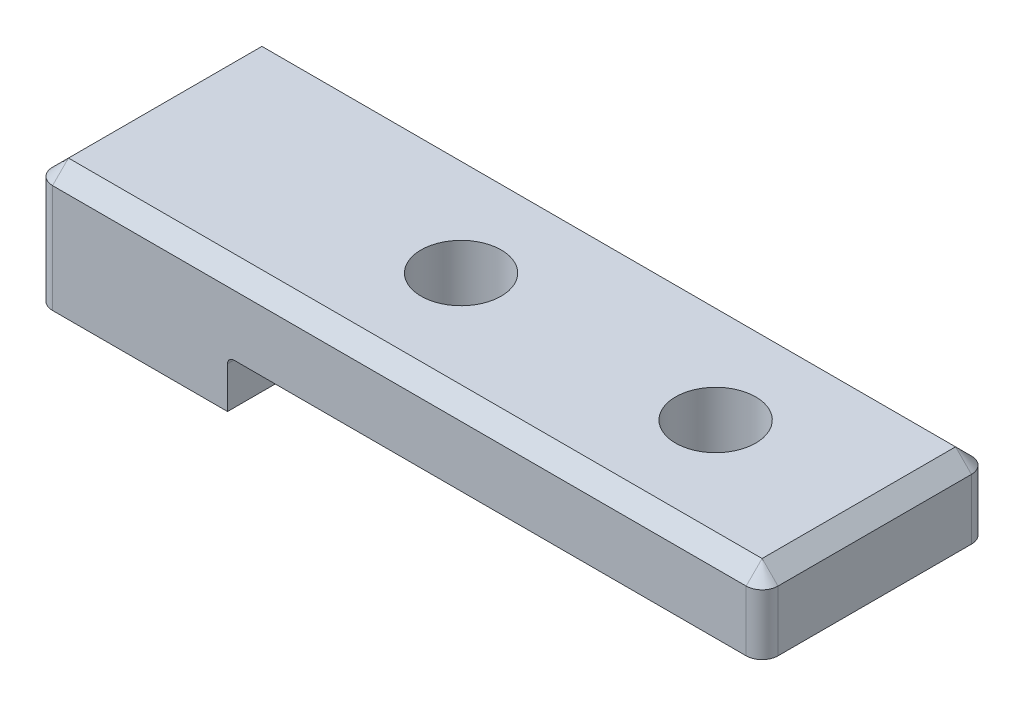
ISO-10303-21;
HEADER;
FILE_DESCRIPTION(('STEP AP214'),'2;1');
FILE_NAME('part.step','',(''),(''),'','','');
FILE_SCHEMA(('AUTOMOTIVE_DESIGN { 1 0 10303 214 1 1 1 1 }'));
ENDSEC;
DATA;
#1=APPLICATION_CONTEXT('core data for automotive mechanical design processes');
#2=APPLICATION_PROTOCOL_DEFINITION('international standard','automotive_design',2000,#1);
#3=PRODUCT_CONTEXT('',#1,'mechanical');
#4=PRODUCT('Part','Part','',(#3));
#5=PRODUCT_RELATED_PRODUCT_CATEGORY('part','',(#4));
#6=PRODUCT_DEFINITION_FORMATION('','',#4);
#7=PRODUCT_DEFINITION_CONTEXT('part definition',#1,'design');
#8=PRODUCT_DEFINITION('design','',#6,#7);
#9=PRODUCT_DEFINITION_SHAPE('','',#8);
#10=(LENGTH_UNIT() NAMED_UNIT(*) SI_UNIT(.MILLI.,.METRE.));
#11=(NAMED_UNIT(*) PLANE_ANGLE_UNIT() SI_UNIT($,.RADIAN.));
#12=(NAMED_UNIT(*) SI_UNIT($,.STERADIAN.) SOLID_ANGLE_UNIT());
#13=UNCERTAINTY_MEASURE_WITH_UNIT(LENGTH_MEASURE(1.E-05),#10,'distance_accuracy_value','');
#14=(GEOMETRIC_REPRESENTATION_CONTEXT(3) GLOBAL_UNCERTAINTY_ASSIGNED_CONTEXT((#13)) GLOBAL_UNIT_ASSIGNED_CONTEXT((#10,
#11,#12)) REPRESENTATION_CONTEXT('',''));
#15=CARTESIAN_POINT('',(0.,0.,0.));
#16=DIRECTION('',(0.,0.,1.));
#17=DIRECTION('',(1.,0.,0.));
#18=AXIS2_PLACEMENT_3D('',#15,#16,#17);
#19=CARTESIAN_POINT('',(0.,0.,0.));
#20=DIRECTION('',(0.,1.,0.));
#21=DIRECTION('',(0.,0.,1.));
#22=AXIS2_PLACEMENT_3D('',#19,#20,#21);
#23=PLANE('',#22);
#24=CARTESIAN_POINT('',(-2.032,0.,0.));
#25=DIRECTION('',(0.,1.,0.));
#26=DIRECTION('',(0.,0.,1.));
#27=AXIS2_PLACEMENT_3D('',#24,#25,#26);
#28=CIRCLE('',#27,1.6002);
#29=CARTESIAN_POINT('',(-2.032,0.,-1.6002));
#30=VERTEX_POINT('',#29);
#31=EDGE_CURVE('E193',#30,#30,#28,.T.);
#32=ORIENTED_EDGE('',*,*,#31,.T.);
#33=EDGE_LOOP('',(#32));
#34=FACE_BOUND('',#33,.T.);
#35=CARTESIAN_POINT('',(8.128,0.,0.));
#36=DIRECTION('',(0.,1.,0.));
#37=DIRECTION('',(0.,0.,1.));
#38=AXIS2_PLACEMENT_3D('',#35,#36,#37);
#39=CIRCLE('',#38,1.6002);
#40=CARTESIAN_POINT('',(8.128,0.,-1.6002));
#41=VERTEX_POINT('',#40);
#42=EDGE_CURVE('E199',#41,#41,#39,.T.);
#43=ORIENTED_EDGE('',*,*,#42,.T.);
#44=EDGE_LOOP('',(#43));
#45=FACE_BOUND('',#44,.T.);
#46=DIRECTION('',(-1.,0.,0.));
#47=VECTOR('',#46,1.);
#48=CARTESIAN_POINT('',(-14.478,0.,-4.4958));
#49=LINE('',#48,#47);
#50=CARTESIAN_POINT('',(13.843,0.,-4.4958));
#51=VERTEX_POINT('',#50);
#52=CARTESIAN_POINT('',(-13.843,0.,-4.4958));
#53=VERTEX_POINT('',#52);
#54=EDGE_CURVE('E214',#51,#53,#49,.T.);
#55=ORIENTED_EDGE('',*,*,#54,.F.);
#56=CARTESIAN_POINT('',(13.843,0.,-3.8608));
#57=DIRECTION('',(0.,1.,0.));
#58=DIRECTION('',(0.,0.,1.));
#59=AXIS2_PLACEMENT_3D('',#56,#57,#58);
#60=CIRCLE('',#59,0.635);
#61=CARTESIAN_POINT('',(14.478,0.,-3.8608));
#62=VERTEX_POINT('',#61);
#63=EDGE_CURVE('E259',#51,#62,#60,.F.);
#64=ORIENTED_EDGE('',*,*,#63,.T.);
#65=DIRECTION('',(0.,0.,-1.));
#66=VECTOR('',#65,1.);
#67=CARTESIAN_POINT('',(14.478,0.,-4.4958));
#68=LINE('',#67,#66);
#69=CARTESIAN_POINT('',(14.478,0.,3.8608));
#70=VERTEX_POINT('',#69);
#71=EDGE_CURVE('E207',#70,#62,#68,.T.);
#72=ORIENTED_EDGE('',*,*,#71,.F.);
#73=CARTESIAN_POINT('',(13.843,0.,3.8608));
#74=DIRECTION('',(0.,1.,0.));
#75=DIRECTION('',(0.,0.,1.));
#76=AXIS2_PLACEMENT_3D('',#73,#74,#75);
#77=CIRCLE('',#76,0.635);
#78=CARTESIAN_POINT('',(13.843,0.,4.4958));
#79=VERTEX_POINT('',#78);
#80=EDGE_CURVE('E256',#70,#79,#77,.F.);
#81=ORIENTED_EDGE('',*,*,#80,.T.);
#82=DIRECTION('',(1.,0.,0.));
#83=VECTOR('',#82,1.);
#84=CARTESIAN_POINT('',(-14.478,0.,4.4958));
#85=LINE('',#84,#83);
#86=CARTESIAN_POINT('',(-6.604,0.,4.4958));
#87=VERTEX_POINT('',#86);
#88=EDGE_CURVE('E221',#87,#79,#85,.T.);
#89=ORIENTED_EDGE('',*,*,#88,.F.);
#90=DIRECTION('',(0.,0.,1.));
#91=VECTOR('',#90,1.);
#92=CARTESIAN_POINT('',(-6.604,0.,0.));
#93=LINE('',#92,#91);
#94=CARTESIAN_POINT('',(-6.604,0.,-2.1082));
#95=VERTEX_POINT('',#94);
#96=EDGE_CURVE('E225',#87,#95,#93,.F.);
#97=ORIENTED_EDGE('',*,*,#96,.T.);
#98=DIRECTION('',(-1.,0.,0.));
#99=VECTOR('',#98,1.);
#100=CARTESIAN_POINT('',(-14.478,0.,-2.1082));
#101=LINE('',#100,#99);
#102=CARTESIAN_POINT('',(-14.478,0.,-2.1082));
#103=VERTEX_POINT('',#102);
#104=EDGE_CURVE('E228',#95,#103,#101,.T.);
#105=ORIENTED_EDGE('',*,*,#104,.T.);
#106=DIRECTION('',(0.,0.,1.));
#107=VECTOR('',#106,1.);
#108=CARTESIAN_POINT('',(-14.478,0.,-4.4958));
#109=LINE('',#108,#107);
#110=CARTESIAN_POINT('',(-14.478,0.,-3.8608));
#111=VERTEX_POINT('',#110);
#112=EDGE_CURVE('E218',#111,#103,#109,.T.);
#113=ORIENTED_EDGE('',*,*,#112,.F.);
#114=CARTESIAN_POINT('',(-13.843,0.,-3.8608));
#115=DIRECTION('',(0.,1.,0.));
#116=DIRECTION('',(0.,0.,1.));
#117=AXIS2_PLACEMENT_3D('',#114,#115,#116);
#118=CIRCLE('',#117,0.635);
#119=EDGE_CURVE('E253',#111,#53,#118,.F.);
#120=ORIENTED_EDGE('',*,*,#119,.T.);
#121=EDGE_LOOP('',(#55,#64,#72,#81,#89,#97,#105,#113,#120));
#122=FACE_BOUND('',#121,.T.);
#123=ADVANCED_FACE('F47',(#34,#45,#122),#23,.F.);
#124=CARTESIAN_POINT('',(0.,3.048,0.));
#125=DIRECTION('',(0.,1.,0.));
#126=DIRECTION('',(0.,0.,1.));
#127=AXIS2_PLACEMENT_3D('',#124,#125,#126);
#128=PLANE('',#127);
#129=DIRECTION('',(1.,0.,0.));
#130=VECTOR('',#129,1.);
#131=CARTESIAN_POINT('',(13.843,3.048,3.8608));
#132=LINE('',#131,#130);
#133=CARTESIAN_POINT('',(-13.843,3.048,3.8608));
#134=VERTEX_POINT('',#133);
#135=CARTESIAN_POINT('',(13.843,3.048,3.8608));
#136=VERTEX_POINT('',#135);
#137=EDGE_CURVE('E287',#134,#136,#132,.T.);
#138=ORIENTED_EDGE('',*,*,#137,.T.);
#139=DIRECTION('',(0.,0.,-1.));
#140=VECTOR('',#139,1.);
#141=CARTESIAN_POINT('',(13.843,3.048,-3.8608));
#142=LINE('',#141,#140);
#143=CARTESIAN_POINT('',(13.843,3.048,-3.8608));
#144=VERTEX_POINT('',#143);
#145=EDGE_CURVE('E293',#136,#144,#142,.T.);
#146=ORIENTED_EDGE('',*,*,#145,.T.);
#147=DIRECTION('',(-1.,0.,0.));
#148=VECTOR('',#147,1.);
#149=CARTESIAN_POINT('',(-13.843,3.048,-3.8608));
#150=LINE('',#149,#148);
#151=CARTESIAN_POINT('',(-13.843,3.048,-3.8608));
#152=VERTEX_POINT('',#151);
#153=EDGE_CURVE('E290',#144,#152,#150,.T.);
#154=ORIENTED_EDGE('',*,*,#153,.T.);
#155=DIRECTION('',(0.,0.,1.));
#156=VECTOR('',#155,1.);
#157=CARTESIAN_POINT('',(-13.843,3.048,3.8608));
#158=LINE('',#157,#156);
#159=EDGE_CURVE('E284',#152,#134,#158,.T.);
#160=ORIENTED_EDGE('',*,*,#159,.T.);
#161=EDGE_LOOP('',(#138,#146,#154,#160));
#162=FACE_BOUND('',#161,.T.);
#163=CARTESIAN_POINT('',(8.128,3.048,0.));
#164=DIRECTION('',(0.,1.,0.));
#165=DIRECTION('',(0.,0.,1.));
#166=AXIS2_PLACEMENT_3D('',#163,#164,#165);
#167=CIRCLE('',#166,1.6002);
#168=CARTESIAN_POINT('',(8.128,3.048,-1.6002));
#169=VERTEX_POINT('',#168);
#170=EDGE_CURVE('E203',#169,#169,#167,.T.);
#171=ORIENTED_EDGE('',*,*,#170,.F.);
#172=EDGE_LOOP('',(#171));
#173=FACE_BOUND('',#172,.T.);
#174=CARTESIAN_POINT('',(-2.032,3.048,0.));
#175=DIRECTION('',(0.,1.,0.));
#176=DIRECTION('',(0.,0.,1.));
#177=AXIS2_PLACEMENT_3D('',#174,#175,#176);
#178=CIRCLE('',#177,1.6002);
#179=CARTESIAN_POINT('',(-2.032,3.048,-1.6002));
#180=VERTEX_POINT('',#179);
#181=EDGE_CURVE('E195',#180,#180,#178,.T.);
#182=ORIENTED_EDGE('',*,*,#181,.F.);
#183=EDGE_LOOP('',(#182));
#184=FACE_BOUND('',#183,.T.);
#185=ADVANCED_FACE('F403',(#162,#173,#184),#128,.T.);
#186=CARTESIAN_POINT('',(14.478,3.048,-4.4958));
#187=DIRECTION('',(-1.,0.,0.));
#188=DIRECTION('',(0.,0.,1.));
#189=AXIS2_PLACEMENT_3D('',#186,#187,#188);
#190=PLANE('',#189);
#191=DIRECTION('',(0.,-1.,0.));
#192=VECTOR('',#191,1.);
#193=CARTESIAN_POINT('',(14.478,3.048,-3.8608));
#194=LINE('',#193,#192);
#195=CARTESIAN_POINT('',(14.478,2.413,-3.8608));
#196=VERTEX_POINT('',#195);
#197=EDGE_CURVE('E265',#62,#196,#194,.F.);
#198=ORIENTED_EDGE('',*,*,#197,.T.);
#199=DIRECTION('',(0.,0.,1.));
#200=VECTOR('',#199,1.);
#201=CARTESIAN_POINT('',(14.478,2.413,3.8608));
#202=LINE('',#201,#200);
#203=CARTESIAN_POINT('',(14.478,2.413,3.8608));
#204=VERTEX_POINT('',#203);
#205=EDGE_CURVE('E297',#196,#204,#202,.T.);
#206=ORIENTED_EDGE('',*,*,#205,.T.);
#207=DIRECTION('',(0.,-1.,0.));
#208=VECTOR('',#207,1.);
#209=CARTESIAN_POINT('',(14.478,3.048,3.8608));
#210=LINE('',#209,#208);
#211=EDGE_CURVE('E262',#204,#70,#210,.T.);
#212=ORIENTED_EDGE('',*,*,#211,.T.);
#213=ORIENTED_EDGE('',*,*,#71,.T.);
#214=EDGE_LOOP('',(#198,#206,#212,#213));
#215=FACE_BOUND('',#214,.T.);
#216=ADVANCED_FACE('F416',(#215),#190,.F.);
#217=CARTESIAN_POINT('',(-14.478,3.048,-4.4958));
#218=DIRECTION('',(0.,0.,1.));
#219=DIRECTION('',(1.,0.,0.));
#220=AXIS2_PLACEMENT_3D('',#217,#218,#219);
#221=PLANE('',#220);
#222=DIRECTION('',(0.,-1.,0.));
#223=VECTOR('',#222,1.);
#224=CARTESIAN_POINT('',(-13.843,3.048,-4.4958));
#225=LINE('',#224,#223);
#226=CARTESIAN_POINT('',(-13.843,2.413,-4.4958));
#227=VERTEX_POINT('',#226);
#228=EDGE_CURVE('E243',#53,#227,#225,.F.);
#229=ORIENTED_EDGE('',*,*,#228,.T.);
#230=DIRECTION('',(1.,0.,0.));
#231=VECTOR('',#230,1.);
#232=CARTESIAN_POINT('',(13.843,2.413,-4.4958));
#233=LINE('',#232,#231);
#234=CARTESIAN_POINT('',(13.843,2.413,-4.4958));
#235=VERTEX_POINT('',#234);
#236=EDGE_CURVE('E307',#227,#235,#233,.T.);
#237=ORIENTED_EDGE('',*,*,#236,.T.);
#238=DIRECTION('',(0.,-1.,0.));
#239=VECTOR('',#238,1.);
#240=CARTESIAN_POINT('',(13.843,3.048,-4.4958));
#241=LINE('',#240,#239);
#242=EDGE_CURVE('E250',#235,#51,#241,.T.);
#243=ORIENTED_EDGE('',*,*,#242,.T.);
#244=ORIENTED_EDGE('',*,*,#54,.T.);
#245=EDGE_LOOP('',(#229,#237,#243,#244));
#246=FACE_BOUND('',#245,.T.);
#247=ADVANCED_FACE('F362',(#246),#221,.F.);
#248=CARTESIAN_POINT('',(-14.478,3.048,-4.4958));
#249=DIRECTION('',(1.,0.,0.));
#250=DIRECTION('',(0.,0.,-1.));
#251=AXIS2_PLACEMENT_3D('',#248,#249,#250);
#252=PLANE('',#251);
#253=DIRECTION('',(0.,-1.,0.));
#254=VECTOR('',#253,1.);
#255=CARTESIAN_POINT('',(-14.478,3.048,3.8608));
#256=LINE('',#255,#254);
#257=CARTESIAN_POINT('',(-14.478,-1.905,3.8608));
#258=VERTEX_POINT('',#257);
#259=CARTESIAN_POINT('',(-14.478,2.413,3.8608));
#260=VERTEX_POINT('',#259);
#261=EDGE_CURVE('E281',#258,#260,#256,.F.);
#262=ORIENTED_EDGE('',*,*,#261,.T.);
#263=DIRECTION('',(0.,0.,-1.));
#264=VECTOR('',#263,1.);
#265=CARTESIAN_POINT('',(-14.478,2.413,-3.8608));
#266=LINE('',#265,#264);
#267=CARTESIAN_POINT('',(-14.478,2.413,-3.8608));
#268=VERTEX_POINT('',#267);
#269=EDGE_CURVE('E11',#260,#268,#266,.T.);
#270=ORIENTED_EDGE('',*,*,#269,.T.);
#271=DIRECTION('',(0.,-1.,0.));
#272=VECTOR('',#271,1.);
#273=CARTESIAN_POINT('',(-14.478,3.048,-3.8608));
#274=LINE('',#273,#272);
#275=EDGE_CURVE('E278',#268,#111,#274,.T.);
#276=ORIENTED_EDGE('',*,*,#275,.T.);
#277=ORIENTED_EDGE('',*,*,#112,.T.);
#278=CARTESIAN_POINT('',(-14.478,-0.254,-2.1082));
#279=DIRECTION('',(1.,0.,0.));
#280=DIRECTION('',(0.,0.,-1.));
#281=AXIS2_PLACEMENT_3D('',#278,#279,#280);
#282=CIRCLE('',#281,0.254);
#283=CARTESIAN_POINT('',(-14.478,-0.254,-1.8542));
#284=VERTEX_POINT('',#283);
#285=EDGE_CURVE('E158',#103,#284,#282,.T.);
#286=ORIENTED_EDGE('',*,*,#285,.T.);
#287=DIRECTION('',(0.,-1.,0.));
#288=VECTOR('',#287,1.);
#289=CARTESIAN_POINT('',(-14.478,0.,-1.8542));
#290=LINE('',#289,#288);
#291=CARTESIAN_POINT('',(-14.478,-1.905,-1.8542));
#292=VERTEX_POINT('',#291);
#293=EDGE_CURVE('E153',#284,#292,#290,.T.);
#294=ORIENTED_EDGE('',*,*,#293,.T.);
#295=DIRECTION('',(0.,0.,1.));
#296=VECTOR('',#295,1.);
#297=CARTESIAN_POINT('',(-14.478,-1.905,-1.8542));
#298=LINE('',#297,#296);
#299=EDGE_CURVE('E156',#292,#258,#298,.T.);
#300=ORIENTED_EDGE('',*,*,#299,.T.);
#301=EDGE_LOOP('',(#262,#270,#276,#277,#286,#294,#300));
#302=FACE_BOUND('',#301,.T.);
#303=ADVANCED_FACE('F155',(#302),#252,.F.);
#304=CARTESIAN_POINT('',(-14.478,3.048,4.4958));
#305=DIRECTION('',(0.,0.,-1.));
#306=DIRECTION('',(-1.,0.,0.));
#307=AXIS2_PLACEMENT_3D('',#304,#305,#306);
#308=PLANE('',#307);
#309=DIRECTION('',(0.,-1.,0.));
#310=VECTOR('',#309,1.);
#311=CARTESIAN_POINT('',(13.843,3.048,4.4958));
#312=LINE('',#311,#310);
#313=CARTESIAN_POINT('',(13.843,2.413,4.4958));
#314=VERTEX_POINT('',#313);
#315=EDGE_CURVE('E272',#79,#314,#312,.F.);
#316=ORIENTED_EDGE('',*,*,#315,.T.);
#317=DIRECTION('',(-1.,0.,0.));
#318=VECTOR('',#317,1.);
#319=CARTESIAN_POINT('',(-13.843,2.413,4.4958));
#320=LINE('',#319,#318);
#321=CARTESIAN_POINT('',(-13.843,2.413,4.4958));
#322=VERTEX_POINT('',#321);
#323=EDGE_CURVE('E310',#314,#322,#320,.T.);
#324=ORIENTED_EDGE('',*,*,#323,.T.);
#325=DIRECTION('',(0.,-1.,0.));
#326=VECTOR('',#325,1.);
#327=CARTESIAN_POINT('',(-13.843,3.048,4.4958));
#328=LINE('',#327,#326);
#329=CARTESIAN_POINT('',(-13.843,-1.905,4.4958));
#330=VERTEX_POINT('',#329);
#331=EDGE_CURVE('E269',#322,#330,#328,.T.);
#332=ORIENTED_EDGE('',*,*,#331,.T.);
#333=DIRECTION('',(1.,0.,0.));
#334=VECTOR('',#333,1.);
#335=CARTESIAN_POINT('',(-14.478,-1.905,4.4958));
#336=LINE('',#335,#334);
#337=CARTESIAN_POINT('',(-6.858,-1.905,4.4958));
#338=VERTEX_POINT('',#337);
#339=EDGE_CURVE('E185',#330,#338,#336,.T.);
#340=ORIENTED_EDGE('',*,*,#339,.T.);
#341=DIRECTION('',(0.,1.,0.));
#342=VECTOR('',#341,1.);
#343=CARTESIAN_POINT('',(-6.858,-1.905,4.4958));
#344=LINE('',#343,#342);
#345=CARTESIAN_POINT('',(-6.858,-0.254,4.4958));
#346=VERTEX_POINT('',#345);
#347=EDGE_CURVE('E164',#338,#346,#344,.T.);
#348=ORIENTED_EDGE('',*,*,#347,.T.);
#349=CARTESIAN_POINT('',(-6.604,-0.254,4.4958));
#350=DIRECTION('',(0.,0.,-1.));
#351=DIRECTION('',(-1.,0.,0.));
#352=AXIS2_PLACEMENT_3D('',#349,#350,#351);
#353=CIRCLE('',#352,0.254);
#354=EDGE_CURVE('E240',#346,#87,#353,.T.);
#355=ORIENTED_EDGE('',*,*,#354,.T.);
#356=ORIENTED_EDGE('',*,*,#88,.T.);
#357=EDGE_LOOP('',(#316,#324,#332,#340,#348,#355,#356));
#358=FACE_BOUND('',#357,.T.);
#359=ADVANCED_FACE('F383',(#358),#308,.F.);
#360=CARTESIAN_POINT('',(8.128,3.048,0.));
#361=DIRECTION('',(0.,-1.,0.));
#362=DIRECTION('',(0.,0.,-1.));
#363=AXIS2_PLACEMENT_3D('',#360,#361,#362);
#364=CYLINDRICAL_SURFACE('',#363,1.6002);
#365=CARTESIAN_POINT('',(8.128,3.048,-1.6002));
#366=CARTESIAN_POINT('',(8.128,3.01625,-1.6002));
#367=CARTESIAN_POINT('',(8.128,2.9845,-1.6002));
#368=CARTESIAN_POINT('',(8.128,2.921,-1.6002));
#369=CARTESIAN_POINT('',(8.128,2.88925,-1.6002));
#370=CARTESIAN_POINT('',(8.128,2.82575,-1.6002));
#371=CARTESIAN_POINT('',(8.128,2.794,-1.6002));
#372=CARTESIAN_POINT('',(8.128,2.7305,-1.6002));
#373=CARTESIAN_POINT('',(8.128,2.69875,-1.6002));
#374=CARTESIAN_POINT('',(8.128,2.63525,-1.6002));
#375=CARTESIAN_POINT('',(8.128,2.6035,-1.6002));
#376=CARTESIAN_POINT('',(8.128,2.54,-1.6002));
#377=CARTESIAN_POINT('',(8.128,2.50825,-1.6002));
#378=CARTESIAN_POINT('',(8.128,2.44475,-1.6002));
#379=CARTESIAN_POINT('',(8.128,2.413,-1.6002));
#380=CARTESIAN_POINT('',(8.128,2.3495,-1.6002));
#381=CARTESIAN_POINT('',(8.128,2.31775,-1.6002));
#382=CARTESIAN_POINT('',(8.128,2.25425,-1.6002));
#383=CARTESIAN_POINT('',(8.128,2.2225,-1.6002));
#384=CARTESIAN_POINT('',(8.128,2.159,-1.6002));
#385=CARTESIAN_POINT('',(8.128,2.12725,-1.6002));
#386=CARTESIAN_POINT('',(8.128,2.06375,-1.6002));
#387=CARTESIAN_POINT('',(8.128,2.032,-1.6002));
#388=CARTESIAN_POINT('',(8.128,1.9685,-1.6002));
#389=CARTESIAN_POINT('',(8.128,1.93675,-1.6002));
#390=CARTESIAN_POINT('',(8.128,1.87325,-1.6002));
#391=CARTESIAN_POINT('',(8.128,1.8415,-1.6002));
#392=CARTESIAN_POINT('',(8.128,1.778,-1.6002));
#393=CARTESIAN_POINT('',(8.128,1.74625,-1.6002));
#394=CARTESIAN_POINT('',(8.128,1.68275,-1.6002));
#395=CARTESIAN_POINT('',(8.128,1.651,-1.6002));
#396=CARTESIAN_POINT('',(8.128,1.5875,-1.6002));
#397=CARTESIAN_POINT('',(8.128,1.55575,-1.6002));
#398=CARTESIAN_POINT('',(8.128,1.49225,-1.6002));
#399=CARTESIAN_POINT('',(8.128,1.4605,-1.6002));
#400=CARTESIAN_POINT('',(8.128,1.397,-1.6002));
#401=CARTESIAN_POINT('',(8.128,1.36525,-1.6002));
#402=CARTESIAN_POINT('',(8.128,1.30175,-1.6002));
#403=CARTESIAN_POINT('',(8.128,1.27,-1.6002));
#404=CARTESIAN_POINT('',(8.128,1.2065,-1.6002));
#405=CARTESIAN_POINT('',(8.128,1.17475,-1.6002));
#406=CARTESIAN_POINT('',(8.128,1.11125,-1.6002));
#407=CARTESIAN_POINT('',(8.128,1.0795,-1.6002));
#408=CARTESIAN_POINT('',(8.128,1.016,-1.6002));
#409=CARTESIAN_POINT('',(8.128,0.98425,-1.6002));
#410=CARTESIAN_POINT('',(8.128,0.92075,-1.6002));
#411=CARTESIAN_POINT('',(8.128,0.889,-1.6002));
#412=CARTESIAN_POINT('',(8.128,0.8255,-1.6002));
#413=CARTESIAN_POINT('',(8.128,0.79375,-1.6002));
#414=CARTESIAN_POINT('',(8.128,0.73025,-1.6002));
#415=CARTESIAN_POINT('',(8.128,0.6985,-1.6002));
#416=CARTESIAN_POINT('',(8.128,0.635,-1.6002));
#417=CARTESIAN_POINT('',(8.128,0.60325,-1.6002));
#418=CARTESIAN_POINT('',(8.128,0.53975,-1.6002));
#419=CARTESIAN_POINT('',(8.128,0.508,-1.6002));
#420=CARTESIAN_POINT('',(8.128,0.4445,-1.6002));
#421=CARTESIAN_POINT('',(8.128,0.41275,-1.6002));
#422=CARTESIAN_POINT('',(8.128,0.34925,-1.6002));
#423=CARTESIAN_POINT('',(8.128,0.3175,-1.6002));
#424=CARTESIAN_POINT('',(8.128,0.254,-1.6002));
#425=CARTESIAN_POINT('',(8.128,0.22225,-1.6002));
#426=CARTESIAN_POINT('',(8.128,0.15875,-1.6002));
#427=CARTESIAN_POINT('',(8.128,0.127,-1.6002));
#428=CARTESIAN_POINT('',(8.128,0.0634999999999999,-1.6002));
#429=CARTESIAN_POINT('',(8.128,0.03175,-1.6002));
#430=CARTESIAN_POINT('',(8.128,0.,-1.6002));
#431=B_SPLINE_CURVE_WITH_KNOTS('',3,(#365,#366,#367,#368,#369,#370,#371,#372,#373,#374,#375,
#376,#377,#378,#379,#380,#381,#382,#383,#384,#385,#386,#387,#388,#389,#390,#391,#392,#393,#394,
#395,#396,#397,#398,#399,#400,#401,#402,#403,#404,#405,#406,#407,#408,#409,#410,#411,#412,#413,
#414,#415,#416,#417,#418,#419,#420,#421,#422,#423,#424,#425,#426,#427,#428,#429,#430),
.UNSPECIFIED.,.F.,.F.,(4,2,2,2,2,2,2,2,2,2,2,2,2,2,2,2,2,2,2,2,2,2,2,2,2,2,2,2,2,2,2,2,4),(0.,
0.0952499999999998,0.1905,0.28575,0.381,0.47625,0.5715,0.66675,0.762,0.85725,0.9525,1.04775,
1.143,1.23825,1.3335,1.42875,1.524,1.61925,1.7145,1.80975,1.905,2.00025,2.0955,2.19075,2.286,
2.38125,2.4765,2.57175,2.667,2.76225,2.8575,2.95275,3.048),.UNSPECIFIED.);
#432=EDGE_CURVE('BSEAM438',#169,#41,#431,.T.);
#433=ORIENTED_EDGE('',*,*,#170,.T.);
#434=ORIENTED_EDGE('',*,*,#42,.F.);
#435=ORIENTED_EDGE('',*,*,#432,.T.);
#436=ORIENTED_EDGE('',*,*,#432,.F.);
#437=EDGE_LOOP('',(#433,#435,#434,#436));
#438=FACE_BOUND('',#437,.T.);
#439=ADVANCED_FACE('F438',(#438),#364,.F.);
#440=CARTESIAN_POINT('',(-2.032,3.048,0.));
#441=DIRECTION('',(0.,-1.,0.));
#442=DIRECTION('',(0.,0.,-1.));
#443=AXIS2_PLACEMENT_3D('',#440,#441,#442);
#444=CYLINDRICAL_SURFACE('',#443,1.6002);
#445=CARTESIAN_POINT('',(-2.032,3.048,-1.6002));
#446=CARTESIAN_POINT('',(-2.032,3.01625,-1.6002));
#447=CARTESIAN_POINT('',(-2.032,2.9845,-1.6002));
#448=CARTESIAN_POINT('',(-2.032,2.921,-1.6002));
#449=CARTESIAN_POINT('',(-2.032,2.88925,-1.6002));
#450=CARTESIAN_POINT('',(-2.032,2.82575,-1.6002));
#451=CARTESIAN_POINT('',(-2.032,2.794,-1.6002));
#452=CARTESIAN_POINT('',(-2.032,2.7305,-1.6002));
#453=CARTESIAN_POINT('',(-2.032,2.69875,-1.6002));
#454=CARTESIAN_POINT('',(-2.032,2.63525,-1.6002));
#455=CARTESIAN_POINT('',(-2.032,2.6035,-1.6002));
#456=CARTESIAN_POINT('',(-2.032,2.54,-1.6002));
#457=CARTESIAN_POINT('',(-2.032,2.50825,-1.6002));
#458=CARTESIAN_POINT('',(-2.032,2.44475,-1.6002));
#459=CARTESIAN_POINT('',(-2.032,2.413,-1.6002));
#460=CARTESIAN_POINT('',(-2.032,2.3495,-1.6002));
#461=CARTESIAN_POINT('',(-2.032,2.31775,-1.6002));
#462=CARTESIAN_POINT('',(-2.032,2.25425,-1.6002));
#463=CARTESIAN_POINT('',(-2.032,2.2225,-1.6002));
#464=CARTESIAN_POINT('',(-2.032,2.159,-1.6002));
#465=CARTESIAN_POINT('',(-2.032,2.12725,-1.6002));
#466=CARTESIAN_POINT('',(-2.032,2.06375,-1.6002));
#467=CARTESIAN_POINT('',(-2.032,2.032,-1.6002));
#468=CARTESIAN_POINT('',(-2.032,1.9685,-1.6002));
#469=CARTESIAN_POINT('',(-2.032,1.93675,-1.6002));
#470=CARTESIAN_POINT('',(-2.032,1.87325,-1.6002));
#471=CARTESIAN_POINT('',(-2.032,1.8415,-1.6002));
#472=CARTESIAN_POINT('',(-2.032,1.778,-1.6002));
#473=CARTESIAN_POINT('',(-2.032,1.74625,-1.6002));
#474=CARTESIAN_POINT('',(-2.032,1.68275,-1.6002));
#475=CARTESIAN_POINT('',(-2.032,1.651,-1.6002));
#476=CARTESIAN_POINT('',(-2.032,1.5875,-1.6002));
#477=CARTESIAN_POINT('',(-2.032,1.55575,-1.6002));
#478=CARTESIAN_POINT('',(-2.032,1.49225,-1.6002));
#479=CARTESIAN_POINT('',(-2.032,1.4605,-1.6002));
#480=CARTESIAN_POINT('',(-2.032,1.397,-1.6002));
#481=CARTESIAN_POINT('',(-2.032,1.36525,-1.6002));
#482=CARTESIAN_POINT('',(-2.032,1.30175,-1.6002));
#483=CARTESIAN_POINT('',(-2.032,1.27,-1.6002));
#484=CARTESIAN_POINT('',(-2.032,1.2065,-1.6002));
#485=CARTESIAN_POINT('',(-2.032,1.17475,-1.6002));
#486=CARTESIAN_POINT('',(-2.032,1.11125,-1.6002));
#487=CARTESIAN_POINT('',(-2.032,1.0795,-1.6002));
#488=CARTESIAN_POINT('',(-2.032,1.016,-1.6002));
#489=CARTESIAN_POINT('',(-2.032,0.98425,-1.6002));
#490=CARTESIAN_POINT('',(-2.032,0.92075,-1.6002));
#491=CARTESIAN_POINT('',(-2.032,0.889,-1.6002));
#492=CARTESIAN_POINT('',(-2.032,0.8255,-1.6002));
#493=CARTESIAN_POINT('',(-2.032,0.79375,-1.6002));
#494=CARTESIAN_POINT('',(-2.032,0.73025,-1.6002));
#495=CARTESIAN_POINT('',(-2.032,0.6985,-1.6002));
#496=CARTESIAN_POINT('',(-2.032,0.635,-1.6002));
#497=CARTESIAN_POINT('',(-2.032,0.60325,-1.6002));
#498=CARTESIAN_POINT('',(-2.032,0.53975,-1.6002));
#499=CARTESIAN_POINT('',(-2.032,0.508,-1.6002));
#500=CARTESIAN_POINT('',(-2.032,0.4445,-1.6002));
#501=CARTESIAN_POINT('',(-2.032,0.41275,-1.6002));
#502=CARTESIAN_POINT('',(-2.032,0.34925,-1.6002));
#503=CARTESIAN_POINT('',(-2.032,0.3175,-1.6002));
#504=CARTESIAN_POINT('',(-2.032,0.254,-1.6002));
#505=CARTESIAN_POINT('',(-2.032,0.22225,-1.6002));
#506=CARTESIAN_POINT('',(-2.032,0.15875,-1.6002));
#507=CARTESIAN_POINT('',(-2.032,0.127,-1.6002));
#508=CARTESIAN_POINT('',(-2.032,0.0634999999999999,-1.6002));
#509=CARTESIAN_POINT('',(-2.032,0.03175,-1.6002));
#510=CARTESIAN_POINT('',(-2.032,0.,-1.6002));
#511=B_SPLINE_CURVE_WITH_KNOTS('',3,(#445,#446,#447,#448,#449,#450,#451,#452,#453,#454,#455,
#456,#457,#458,#459,#460,#461,#462,#463,#464,#465,#466,#467,#468,#469,#470,#471,#472,#473,#474,
#475,#476,#477,#478,#479,#480,#481,#482,#483,#484,#485,#486,#487,#488,#489,#490,#491,#492,#493,
#494,#495,#496,#497,#498,#499,#500,#501,#502,#503,#504,#505,#506,#507,#508,#509,#510),
.UNSPECIFIED.,.F.,.F.,(4,2,2,2,2,2,2,2,2,2,2,2,2,2,2,2,2,2,2,2,2,2,2,2,2,2,2,2,2,2,2,2,4),(0.,
0.0952499999999998,0.1905,0.28575,0.381,0.47625,0.5715,0.66675,0.762,0.85725,0.9525,1.04775,
1.143,1.23825,1.3335,1.42875,1.524,1.61925,1.7145,1.80975,1.905,2.00025,2.0955,2.19075,2.286,
2.38125,2.4765,2.57175,2.667,2.76225,2.8575,2.95275,3.048),.UNSPECIFIED.);
#512=EDGE_CURVE('BSEAM577',#180,#30,#511,.T.);
#513=ORIENTED_EDGE('',*,*,#181,.T.);
#514=ORIENTED_EDGE('',*,*,#31,.F.);
#515=ORIENTED_EDGE('',*,*,#512,.T.);
#516=ORIENTED_EDGE('',*,*,#512,.F.);
#517=EDGE_LOOP('',(#513,#515,#514,#516));
#518=FACE_BOUND('',#517,.T.);
#519=ADVANCED_FACE('F577',(#518),#444,.F.);
#520=CARTESIAN_POINT('',(-6.858,-1.905,-1.8542));
#521=DIRECTION('',(1.,0.,0.));
#522=DIRECTION('',(0.,1.,0.));
#523=AXIS2_PLACEMENT_3D('',#520,#521,#522);
#524=PLANE('',#523);
#525=DIRECTION('',(0.,1.,0.));
#526=VECTOR('',#525,1.);
#527=CARTESIAN_POINT('',(-6.858,-1.905,-1.8542));
#528=LINE('',#527,#526);
#529=CARTESIAN_POINT('',(-6.858,-1.905,-1.8542));
#530=VERTEX_POINT('',#529);
#531=CARTESIAN_POINT('',(-6.858,-0.254,-1.8542));
#532=VERTEX_POINT('',#531);
#533=EDGE_CURVE('E176',#530,#532,#528,.T.);
#534=ORIENTED_EDGE('',*,*,#533,.T.);
#535=DIRECTION('',(0.,0.,1.));
#536=VECTOR('',#535,1.);
#537=CARTESIAN_POINT('',(-6.858,-0.254,-1.8542));
#538=LINE('',#537,#536);
#539=EDGE_CURVE('E235',#532,#346,#538,.T.);
#540=ORIENTED_EDGE('',*,*,#539,.T.);
#541=ORIENTED_EDGE('',*,*,#347,.F.);
#542=DIRECTION('',(0.,0.,1.));
#543=VECTOR('',#542,1.);
#544=CARTESIAN_POINT('',(-6.858,-1.905,-1.8542));
#545=LINE('',#544,#543);
#546=EDGE_CURVE('E175',#530,#338,#545,.T.);
#547=ORIENTED_EDGE('',*,*,#546,.F.);
#548=EDGE_LOOP('',(#534,#540,#541,#547));
#549=FACE_BOUND('',#548,.T.);
#550=ADVANCED_FACE('F375',(#549),#524,.T.);
#551=CARTESIAN_POINT('',(-14.478,-1.905,-1.8542));
#552=DIRECTION('',(0.,-1.,0.));
#553=DIRECTION('',(0.,0.,-1.));
#554=AXIS2_PLACEMENT_3D('',#551,#552,#553);
#555=PLANE('',#554);
#556=ORIENTED_EDGE('',*,*,#339,.F.);
#557=CARTESIAN_POINT('',(-13.843,-1.905,3.8608));
#558=DIRECTION('',(0.,-1.,0.));
#559=DIRECTION('',(0.,0.,-1.));
#560=AXIS2_PLACEMENT_3D('',#557,#558,#559);
#561=CIRCLE('',#560,0.635);
#562=EDGE_CURVE('E173',#330,#258,#561,.T.);
#563=ORIENTED_EDGE('',*,*,#562,.T.);
#564=ORIENTED_EDGE('',*,*,#299,.F.);
#565=DIRECTION('',(1.,0.,0.));
#566=VECTOR('',#565,1.);
#567=CARTESIAN_POINT('',(-14.478,-1.905,-1.8542));
#568=LINE('',#567,#566);
#569=EDGE_CURVE('E163',#292,#530,#568,.T.);
#570=ORIENTED_EDGE('',*,*,#569,.T.);
#571=ORIENTED_EDGE('',*,*,#546,.T.);
#572=EDGE_LOOP('',(#556,#563,#564,#570,#571));
#573=FACE_BOUND('',#572,.T.);
#574=ADVANCED_FACE('F169',(#573),#555,.T.);
#575=CARTESIAN_POINT('',(0.,0.,-1.8542));
#576=DIRECTION('',(0.,0.,1.));
#577=DIRECTION('',(1.,0.,0.));
#578=AXIS2_PLACEMENT_3D('',#575,#576,#577);
#579=PLANE('',#578);
#580=ORIENTED_EDGE('',*,*,#293,.F.);
#581=DIRECTION('',(-1.,0.,0.));
#582=VECTOR('',#581,1.);
#583=CARTESIAN_POINT('',(-6.858,-0.254,-1.8542));
#584=LINE('',#583,#582);
#585=EDGE_CURVE('E232',#284,#532,#584,.F.);
#586=ORIENTED_EDGE('',*,*,#585,.T.);
#587=ORIENTED_EDGE('',*,*,#533,.F.);
#588=ORIENTED_EDGE('',*,*,#569,.F.);
#589=EDGE_LOOP('',(#580,#586,#587,#588));
#590=FACE_BOUND('',#589,.T.);
#591=ADVANCED_FACE('F178',(#590),#579,.F.);
#592=CARTESIAN_POINT('',(-6.604,-0.254,-1.8542));
#593=DIRECTION('',(0.,0.,1.));
#594=DIRECTION('',(1.,0.,0.));
#595=AXIS2_PLACEMENT_3D('',#592,#593,#594);
#596=CYLINDRICAL_SURFACE('',#595,0.254);
#597=ORIENTED_EDGE('',*,*,#354,.F.);
#598=ORIENTED_EDGE('',*,*,#539,.F.);
#599=CARTESIAN_POINT('',(-6.604,-0.254,-2.1082));
#600=DIRECTION('',(0.707106781186547,0.,0.707106781186547));
#601=DIRECTION('',(-0.707106781186547,0.,0.707106781186547));
#602=AXIS2_PLACEMENT_3D('',#599,#600,#601);
#603=ELLIPSE('',#602,0.359210244842766,0.254);
#604=EDGE_CURVE('E188',#95,#532,#603,.T.);
#605=ORIENTED_EDGE('',*,*,#604,.F.);
#606=ORIENTED_EDGE('',*,*,#96,.F.);
#607=EDGE_LOOP('',(#597,#598,#605,#606));
#608=FACE_BOUND('',#607,.T.);
#609=ADVANCED_FACE('F379',(#608),#596,.F.);
#610=CARTESIAN_POINT('',(0.,-0.254,-2.1082));
#611=DIRECTION('',(1.,0.,0.));
#612=DIRECTION('',(0.,0.,-1.));
#613=AXIS2_PLACEMENT_3D('',#610,#611,#612);
#614=CYLINDRICAL_SURFACE('',#613,0.254);
#615=ORIENTED_EDGE('',*,*,#604,.T.);
#616=ORIENTED_EDGE('',*,*,#585,.F.);
#617=ORIENTED_EDGE('',*,*,#285,.F.);
#618=ORIENTED_EDGE('',*,*,#104,.F.);
#619=EDGE_LOOP('',(#615,#616,#617,#618));
#620=FACE_BOUND('',#619,.T.);
#621=ADVANCED_FACE('F371',(#620),#614,.F.);
#622=CARTESIAN_POINT('',(13.843,3.048,-3.8608));
#623=DIRECTION('',(0.,-1.,0.));
#624=DIRECTION('',(0.,0.,-1.));
#625=AXIS2_PLACEMENT_3D('',#622,#623,#624);
#626=CYLINDRICAL_SURFACE('',#625,0.635);
#627=ORIENTED_EDGE('',*,*,#242,.F.);
#628=CARTESIAN_POINT('',(13.843,2.413,-3.8608));
#629=DIRECTION('',(0.,1.,0.));
#630=DIRECTION('',(0.,0.,1.));
#631=AXIS2_PLACEMENT_3D('',#628,#629,#630);
#632=CIRCLE('',#631,0.635);
#633=EDGE_CURVE('E301',#235,#196,#632,.F.);
#634=ORIENTED_EDGE('',*,*,#633,.T.);
#635=ORIENTED_EDGE('',*,*,#197,.F.);
#636=ORIENTED_EDGE('',*,*,#63,.F.);
#637=EDGE_LOOP('',(#627,#634,#635,#636));
#638=FACE_BOUND('',#637,.T.);
#639=ADVANCED_FACE('F414',(#638),#626,.T.);
#640=CARTESIAN_POINT('',(13.843,3.048,3.8608));
#641=DIRECTION('',(0.,-1.,0.));
#642=DIRECTION('',(0.,0.,-1.));
#643=AXIS2_PLACEMENT_3D('',#640,#641,#642);
#644=CYLINDRICAL_SURFACE('',#643,0.635);
#645=ORIENTED_EDGE('',*,*,#211,.F.);
#646=CARTESIAN_POINT('',(13.843,2.413,3.8608));
#647=DIRECTION('',(0.,1.,0.));
#648=DIRECTION('',(0.,0.,1.));
#649=AXIS2_PLACEMENT_3D('',#646,#647,#648);
#650=CIRCLE('',#649,0.635);
#651=EDGE_CURVE('E304',#204,#314,#650,.F.);
#652=ORIENTED_EDGE('',*,*,#651,.T.);
#653=ORIENTED_EDGE('',*,*,#315,.F.);
#654=ORIENTED_EDGE('',*,*,#80,.F.);
#655=EDGE_LOOP('',(#645,#652,#653,#654));
#656=FACE_BOUND('',#655,.T.);
#657=ADVANCED_FACE('F388',(#656),#644,.T.);
#658=CARTESIAN_POINT('',(-13.843,3.048,3.8608));
#659=DIRECTION('',(0.,-1.,0.));
#660=DIRECTION('',(0.,0.,-1.));
#661=AXIS2_PLACEMENT_3D('',#658,#659,#660);
#662=CYLINDRICAL_SURFACE('',#661,0.635);
#663=ORIENTED_EDGE('',*,*,#331,.F.);
#664=CARTESIAN_POINT('',(-13.843,2.413,3.8608));
#665=DIRECTION('',(0.,1.,0.));
#666=DIRECTION('',(0.,0.,1.));
#667=AXIS2_PLACEMENT_3D('',#664,#665,#666);
#668=CIRCLE('',#667,0.635);
#669=EDGE_CURVE('E58',#322,#260,#668,.F.);
#670=ORIENTED_EDGE('',*,*,#669,.T.);
#671=ORIENTED_EDGE('',*,*,#261,.F.);
#672=ORIENTED_EDGE('',*,*,#562,.F.);
#673=EDGE_LOOP('',(#663,#670,#671,#672));
#674=FACE_BOUND('',#673,.T.);
#675=ADVANCED_FACE('F466',(#674),#662,.T.);
#676=CARTESIAN_POINT('',(-13.843,3.048,-3.8608));
#677=DIRECTION('',(0.,-1.,0.));
#678=DIRECTION('',(0.,0.,-1.));
#679=AXIS2_PLACEMENT_3D('',#676,#677,#678);
#680=CYLINDRICAL_SURFACE('',#679,0.635);
#681=ORIENTED_EDGE('',*,*,#275,.F.);
#682=CARTESIAN_POINT('',(-13.843,2.413,-3.8608));
#683=DIRECTION('',(0.,1.,0.));
#684=DIRECTION('',(0.,0.,1.));
#685=AXIS2_PLACEMENT_3D('',#682,#683,#684);
#686=CIRCLE('',#685,0.635);
#687=EDGE_CURVE('E313',#268,#227,#686,.F.);
#688=ORIENTED_EDGE('',*,*,#687,.T.);
#689=ORIENTED_EDGE('',*,*,#228,.F.);
#690=ORIENTED_EDGE('',*,*,#119,.F.);
#691=EDGE_LOOP('',(#681,#688,#689,#690));
#692=FACE_BOUND('',#691,.T.);
#693=ADVANCED_FACE('F359',(#692),#680,.T.);
#694=CARTESIAN_POINT('',(-13.843,3.048,0.));
#695=DIRECTION('',(-0.70710678118655,0.707106781186545,0.));
#696=DIRECTION('',(0.,0.,-1.));
#697=AXIS2_PLACEMENT_3D('',#694,#695,#696);
#698=PLANE('',#697);
#699=DIRECTION('',(0.707106781186545,0.70710678118655,0.));
#700=VECTOR('',#699,1.);
#701=CARTESIAN_POINT('',(-14.478,2.413,-3.8608));
#702=LINE('',#701,#700);
#703=EDGE_CURVE('E339',#268,#152,#702,.T.);
#704=ORIENTED_EDGE('',*,*,#703,.F.);
#705=ORIENTED_EDGE('',*,*,#269,.F.);
#706=DIRECTION('',(-0.707106781186545,-0.70710678118655,0.));
#707=VECTOR('',#706,1.);
#708=CARTESIAN_POINT('',(-13.843,3.048,3.8608));
#709=LINE('',#708,#707);
#710=EDGE_CURVE('E52',#134,#260,#709,.T.);
#711=ORIENTED_EDGE('',*,*,#710,.F.);
#712=ORIENTED_EDGE('',*,*,#159,.F.);
#713=EDGE_LOOP('',(#704,#705,#711,#712));
#714=FACE_BOUND('',#713,.T.);
#715=ADVANCED_FACE('F50',(#714),#698,.T.);
#716=CARTESIAN_POINT('',(-13.843,2.413,3.8608));
#717=DIRECTION('',(0.,-1.,0.));
#718=DIRECTION('',(0.,0.,-1.));
#719=AXIS2_PLACEMENT_3D('',#716,#717,#718);
#720=CONICAL_SURFACE('',#719,0.635,0.785398163397446);
#721=ORIENTED_EDGE('',*,*,#710,.T.);
#722=ORIENTED_EDGE('',*,*,#669,.F.);
#723=DIRECTION('',(0.,-0.70710678118655,0.707106781186546));
#724=VECTOR('',#723,1.);
#725=CARTESIAN_POINT('',(-13.843,3.048,3.8608));
#726=LINE('',#725,#724);
#727=EDGE_CURVE('E336',#134,#322,#726,.T.);
#728=ORIENTED_EDGE('',*,*,#727,.F.);
#729=EDGE_LOOP('',(#721,#722,#728));
#730=FACE_BOUND('',#729,.T.);
#731=ADVANCED_FACE('F351',(#730),#720,.T.);
#732=CARTESIAN_POINT('',(-13.843,2.413,-3.8608));
#733=DIRECTION('',(0.,-1.,0.));
#734=DIRECTION('',(0.,0.,-1.));
#735=AXIS2_PLACEMENT_3D('',#732,#733,#734);
#736=CONICAL_SURFACE('',#735,0.635,0.785398163397446);
#737=ORIENTED_EDGE('',*,*,#687,.F.);
#738=ORIENTED_EDGE('',*,*,#703,.T.);
#739=DIRECTION('',(0.,0.70710678118655,0.707106781186546));
#740=VECTOR('',#739,1.);
#741=CARTESIAN_POINT('',(-13.843,2.413,-4.4958));
#742=LINE('',#741,#740);
#743=EDGE_CURVE('E332',#227,#152,#742,.T.);
#744=ORIENTED_EDGE('',*,*,#743,.F.);
#745=EDGE_LOOP('',(#737,#738,#744));
#746=FACE_BOUND('',#745,.T.);
#747=ADVANCED_FACE('F355',(#746),#736,.T.);
#748=CARTESIAN_POINT('',(0.,3.048,3.8608));
#749=DIRECTION('',(0.,0.707106781186546,0.70710678118655));
#750=DIRECTION('',(-1.,0.,0.));
#751=AXIS2_PLACEMENT_3D('',#748,#749,#750);
#752=PLANE('',#751);
#753=ORIENTED_EDGE('',*,*,#727,.T.);
#754=ORIENTED_EDGE('',*,*,#323,.F.);
#755=DIRECTION('',(0.,-0.70710678118655,0.707106781186546));
#756=VECTOR('',#755,1.);
#757=CARTESIAN_POINT('',(13.843,3.048,3.8608));
#758=LINE('',#757,#756);
#759=EDGE_CURVE('E328',#136,#314,#758,.T.);
#760=ORIENTED_EDGE('',*,*,#759,.F.);
#761=ORIENTED_EDGE('',*,*,#137,.F.);
#762=EDGE_LOOP('',(#753,#754,#760,#761));
#763=FACE_BOUND('',#762,.T.);
#764=ADVANCED_FACE('F393',(#763),#752,.T.);
#765=CARTESIAN_POINT('',(0.,3.048,-3.8608));
#766=DIRECTION('',(0.,0.707106781186546,-0.70710678118655));
#767=DIRECTION('',(1.,0.,0.));
#768=AXIS2_PLACEMENT_3D('',#765,#766,#767);
#769=PLANE('',#768);
#770=ORIENTED_EDGE('',*,*,#743,.T.);
#771=ORIENTED_EDGE('',*,*,#153,.F.);
#772=DIRECTION('',(0.,0.70710678118655,0.707106781186546));
#773=VECTOR('',#772,1.);
#774=CARTESIAN_POINT('',(13.843,2.413,-4.4958));
#775=LINE('',#774,#773);
#776=EDGE_CURVE('E324',#235,#144,#775,.T.);
#777=ORIENTED_EDGE('',*,*,#776,.F.);
#778=ORIENTED_EDGE('',*,*,#236,.F.);
#779=EDGE_LOOP('',(#770,#771,#777,#778));
#780=FACE_BOUND('',#779,.T.);
#781=ADVANCED_FACE('F408',(#780),#769,.T.);
#782=CARTESIAN_POINT('',(13.843,2.413,3.8608));
#783=DIRECTION('',(0.,-1.,0.));
#784=DIRECTION('',(0.,0.,-1.));
#785=AXIS2_PLACEMENT_3D('',#782,#783,#784);
#786=CONICAL_SURFACE('',#785,0.635,0.785398163397446);
#787=ORIENTED_EDGE('',*,*,#759,.T.);
#788=ORIENTED_EDGE('',*,*,#651,.F.);
#789=DIRECTION('',(0.707106781186546,-0.70710678118655,0.));
#790=VECTOR('',#789,1.);
#791=CARTESIAN_POINT('',(13.843,3.048,3.8608));
#792=LINE('',#791,#790);
#793=EDGE_CURVE('E321',#136,#204,#792,.T.);
#794=ORIENTED_EDGE('',*,*,#793,.F.);
#795=EDGE_LOOP('',(#787,#788,#794));
#796=FACE_BOUND('',#795,.T.);
#797=ADVANCED_FACE('F396',(#796),#786,.T.);
#798=CARTESIAN_POINT('',(13.843,2.413,-3.8608));
#799=DIRECTION('',(0.,-1.,0.));
#800=DIRECTION('',(0.,0.,-1.));
#801=AXIS2_PLACEMENT_3D('',#798,#799,#800);
#802=CONICAL_SURFACE('',#801,0.635,0.785398163397446);
#803=ORIENTED_EDGE('',*,*,#633,.F.);
#804=ORIENTED_EDGE('',*,*,#776,.T.);
#805=DIRECTION('',(-0.707106781186546,0.70710678118655,0.));
#806=VECTOR('',#805,1.);
#807=CARTESIAN_POINT('',(14.478,2.413,-3.8608));
#808=LINE('',#807,#806);
#809=EDGE_CURVE('E318',#196,#144,#808,.T.);
#810=ORIENTED_EDGE('',*,*,#809,.F.);
#811=EDGE_LOOP('',(#803,#804,#810));
#812=FACE_BOUND('',#811,.T.);
#813=ADVANCED_FACE('F411',(#812),#802,.T.);
#814=CARTESIAN_POINT('',(13.843,3.048,0.));
#815=DIRECTION('',(0.70710678118655,0.707106781186546,0.));
#816=DIRECTION('',(0.,0.,1.));
#817=AXIS2_PLACEMENT_3D('',#814,#815,#816);
#818=PLANE('',#817);
#819=ORIENTED_EDGE('',*,*,#793,.T.);
#820=ORIENTED_EDGE('',*,*,#205,.F.);
#821=ORIENTED_EDGE('',*,*,#809,.T.);
#822=ORIENTED_EDGE('',*,*,#145,.F.);
#823=EDGE_LOOP('',(#819,#820,#821,#822));
#824=FACE_BOUND('',#823,.T.);
#825=ADVANCED_FACE('F400',(#824),#818,.T.);
#826=CLOSED_SHELL('',(#123,#185,#216,#247,#303,#359,#439,#519,#550,#574,#591,#609,#621,#639,
#657,#675,#693,#715,#731,#747,#764,#781,#797,#813,#825));
#827=MANIFOLD_SOLID_BREP('B2',#826);
#828=ADVANCED_BREP_SHAPE_REPRESENTATION('',(#18,#827),#14);
#829=SHAPE_DEFINITION_REPRESENTATION(#9,#828);
ENDSEC;
END-ISO-10303-21;
